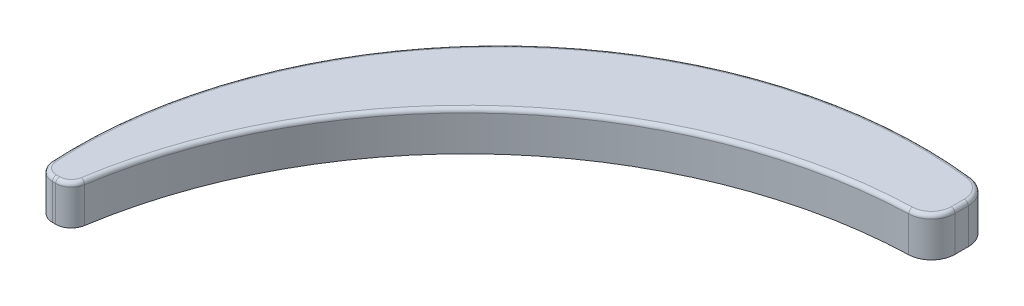
ISO-10303-21;
HEADER;
FILE_DESCRIPTION(('STEP AP214'),'2;1');
FILE_NAME('part.step','',(''),(''),'','','');
FILE_SCHEMA(('AUTOMOTIVE_DESIGN { 1 0 10303 214 1 1 1 1 }'));
ENDSEC;
DATA;
#1=APPLICATION_CONTEXT('core data for automotive mechanical design processes');
#2=APPLICATION_PROTOCOL_DEFINITION('international standard','automotive_design',2000,#1);
#3=PRODUCT_CONTEXT('',#1,'mechanical');
#4=PRODUCT('Part','Part','',(#3));
#5=PRODUCT_RELATED_PRODUCT_CATEGORY('part','',(#4));
#6=PRODUCT_DEFINITION_FORMATION('','',#4);
#7=PRODUCT_DEFINITION_CONTEXT('part definition',#1,'design');
#8=PRODUCT_DEFINITION('design','',#6,#7);
#9=PRODUCT_DEFINITION_SHAPE('','',#8);
#10=(LENGTH_UNIT() NAMED_UNIT(*) SI_UNIT(.MILLI.,.METRE.));
#11=(NAMED_UNIT(*) PLANE_ANGLE_UNIT() SI_UNIT($,.RADIAN.));
#12=(NAMED_UNIT(*) SI_UNIT($,.STERADIAN.) SOLID_ANGLE_UNIT());
#13=UNCERTAINTY_MEASURE_WITH_UNIT(LENGTH_MEASURE(1.E-05),#10,'distance_accuracy_value','');
#14=(GEOMETRIC_REPRESENTATION_CONTEXT(3) GLOBAL_UNCERTAINTY_ASSIGNED_CONTEXT((#13)) GLOBAL_UNIT_ASSIGNED_CONTEXT((#10,
#11,#12)) REPRESENTATION_CONTEXT('',''));
#15=CARTESIAN_POINT('',(0.,0.,0.));
#16=DIRECTION('',(0.,0.,1.));
#17=DIRECTION('',(1.,0.,0.));
#18=AXIS2_PLACEMENT_3D('',#15,#16,#17);
#19=CARTESIAN_POINT('',(32.0869188551007,5.,-59.8439355191756));
#20=DIRECTION('',(0.,-1.,0.));
#21=DIRECTION('',(0.,0.,-1.));
#22=AXIS2_PLACEMENT_3D('',#19,#20,#21);
#23=CYLINDRICAL_SURFACE('',#22,3.);
#24=DIRECTION('',(0.,-1.,0.));
#25=VECTOR('',#24,1.);
#26=CARTESIAN_POINT('',(35.0869188551007,5.,-59.8439355191756));
#27=LINE('',#26,#25);
#28=CARTESIAN_POINT('',(35.0869188551007,4.5,-59.8439355191756));
#29=VERTEX_POINT('',#28);
#30=CARTESIAN_POINT('',(35.0869188551007,0.,-59.8439355191756));
#31=VERTEX_POINT('',#30);
#32=EDGE_CURVE('E123',#29,#31,#27,.T.);
#33=ORIENTED_EDGE('',*,*,#32,.F.);
#34=CARTESIAN_POINT('',(32.0869188551007,4.5,-59.8439355191756));
#35=DIRECTION('',(0.,1.,0.));
#36=DIRECTION('',(0.,0.,1.));
#37=AXIS2_PLACEMENT_3D('',#34,#35,#36);
#38=CIRCLE('',#37,3.);
#39=CARTESIAN_POINT('',(32.1848858792723,4.5,-56.8455355354885));
#40=VERTEX_POINT('',#39);
#41=EDGE_CURVE('E11',#29,#40,#38,.F.);
#42=ORIENTED_EDGE('',*,*,#41,.T.);
#43=DIRECTION('',(0.,-1.,0.));
#44=VECTOR('',#43,1.);
#45=CARTESIAN_POINT('',(32.1848858792723,5.,-56.8455355354885));
#46=LINE('',#45,#44);
#47=CARTESIAN_POINT('',(32.1848858792723,0.,-56.8455355354885));
#48=VERTEX_POINT('',#47);
#49=EDGE_CURVE('E144',#40,#48,#46,.T.);
#50=ORIENTED_EDGE('',*,*,#49,.T.);
#51=CARTESIAN_POINT('',(32.0869188551007,0.,-59.8439355191756));
#52=DIRECTION('',(0.,1.,0.));
#53=DIRECTION('',(0.,0.,1.));
#54=AXIS2_PLACEMENT_3D('',#51,#52,#53);
#55=CIRCLE('',#54,3.);
#56=EDGE_CURVE('E138',#48,#31,#55,.T.);
#57=ORIENTED_EDGE('',*,*,#56,.T.);
#58=EDGE_LOOP('',(#33,#42,#50,#57));
#59=FACE_BOUND('',#58,.T.);
#60=ADVANCED_FACE('F35',(#59),#23,.T.);
#61=CARTESIAN_POINT('',(35.0869188551007,5.,-61.5224925150095));
#62=DIRECTION('',(-1.,0.,0.));
#63=DIRECTION('',(0.,0.,1.));
#64=AXIS2_PLACEMENT_3D('',#61,#62,#63);
#65=PLANE('',#64);
#66=DIRECTION('',(0.,-1.,0.));
#67=VECTOR('',#66,1.);
#68=CARTESIAN_POINT('',(35.0869188551007,5.,-61.5224925150095));
#69=LINE('',#68,#67);
#70=CARTESIAN_POINT('',(35.0869188551007,4.5,-61.5224925150095));
#71=VERTEX_POINT('',#70);
#72=CARTESIAN_POINT('',(35.0869188551007,0.,-61.5224925150095));
#73=VERTEX_POINT('',#72);
#74=EDGE_CURVE('E132',#71,#73,#69,.T.);
#75=ORIENTED_EDGE('',*,*,#74,.F.);
#76=DIRECTION('',(0.,0.,-1.));
#77=VECTOR('',#76,1.);
#78=CARTESIAN_POINT('',(35.0869188551007,4.5,-59.8439355191756));
#79=LINE('',#78,#77);
#80=EDGE_CURVE('E44',#71,#29,#79,.F.);
#81=ORIENTED_EDGE('',*,*,#80,.T.);
#82=ORIENTED_EDGE('',*,*,#32,.T.);
#83=DIRECTION('',(0.,0.,-1.));
#84=VECTOR('',#83,1.);
#85=CARTESIAN_POINT('',(35.0869188551007,0.,-61.5224925150095));
#86=LINE('',#85,#84);
#87=EDGE_CURVE('E126',#31,#73,#86,.T.);
#88=ORIENTED_EDGE('',*,*,#87,.T.);
#89=EDGE_LOOP('',(#75,#81,#82,#88));
#90=FACE_BOUND('',#89,.T.);
#91=ADVANCED_FACE('F125',(#90),#65,.F.);
#92=CARTESIAN_POINT('',(32.0869188551007,5.,-61.5224925150095));
#93=DIRECTION('',(0.,-1.,0.));
#94=DIRECTION('',(0.,0.,-1.));
#95=AXIS2_PLACEMENT_3D('',#92,#93,#94);
#96=CYLINDRICAL_SURFACE('',#95,2.99999999999999);
#97=DIRECTION('',(0.,-1.,0.));
#98=VECTOR('',#97,1.);
#99=CARTESIAN_POINT('',(32.439797129918,5.,-64.5016663808928));
#100=LINE('',#99,#98);
#101=CARTESIAN_POINT('',(32.439797129918,4.5,-64.5016663808928));
#102=VERTEX_POINT('',#101);
#103=CARTESIAN_POINT('',(32.439797129918,0.,-64.5016663808928));
#104=VERTEX_POINT('',#103);
#105=EDGE_CURVE('E174',#102,#104,#100,.T.);
#106=ORIENTED_EDGE('',*,*,#105,.F.);
#107=CARTESIAN_POINT('',(32.0869188551007,4.5,-61.5224925150095));
#108=DIRECTION('',(0.,1.,0.));
#109=DIRECTION('',(0.,0.,1.));
#110=AXIS2_PLACEMENT_3D('',#107,#108,#109);
#111=CIRCLE('',#110,2.99999999999999);
#112=EDGE_CURVE('E59',#102,#71,#111,.F.);
#113=ORIENTED_EDGE('',*,*,#112,.T.);
#114=ORIENTED_EDGE('',*,*,#74,.T.);
#115=CARTESIAN_POINT('',(32.0869188551007,0.,-61.5224925150095));
#116=DIRECTION('',(0.,1.,0.));
#117=DIRECTION('',(0.,0.,1.));
#118=AXIS2_PLACEMENT_3D('',#115,#116,#117);
#119=CIRCLE('',#118,2.99999999999999);
#120=EDGE_CURVE('E141',#73,#104,#119,.T.);
#121=ORIENTED_EDGE('',*,*,#120,.T.);
#122=EDGE_LOOP('',(#106,#113,#114,#121));
#123=FACE_BOUND('',#122,.T.);
#124=ADVANCED_FACE('F277',(#123),#96,.T.);
#125=CARTESIAN_POINT('',(26.0869188551007,5.,-10.8675089954));
#126=DIRECTION('',(0.,-1.,0.));
#127=DIRECTION('',(0.,0.,-1.));
#128=AXIS2_PLACEMENT_3D('',#125,#126,#127);
#129=CYLINDRICAL_SURFACE('',#128,54.0090909090909);
#130=DIRECTION('',(0.,-1.,0.));
#131=VECTOR('',#130,1.);
#132=CARTESIAN_POINT('',(-27.8367871367342,5.,-7.83174995809138));
#133=LINE('',#132,#131);
#134=CARTESIAN_POINT('',(-27.8367871367342,4.5,-7.83174995809138));
#135=VERTEX_POINT('',#134);
#136=CARTESIAN_POINT('',(-27.8367871367342,0.,-7.83174995809138));
#137=VERTEX_POINT('',#136);
#138=EDGE_CURVE('E172',#135,#137,#133,.T.);
#139=ORIENTED_EDGE('',*,*,#138,.F.);
#140=CARTESIAN_POINT('',(26.0869188551007,4.5,-10.8675089954));
#141=DIRECTION('',(0.,1.,0.));
#142=DIRECTION('',(0.,0.,1.));
#143=AXIS2_PLACEMENT_3D('',#140,#141,#142);
#144=CIRCLE('',#143,54.0090909090909);
#145=EDGE_CURVE('E202',#135,#102,#144,.F.);
#146=ORIENTED_EDGE('',*,*,#145,.T.);
#147=ORIENTED_EDGE('',*,*,#105,.T.);
#148=CARTESIAN_POINT('',(26.0869188551007,0.,-10.8675089954));
#149=DIRECTION('',(0.,1.,0.));
#150=DIRECTION('',(0.,0.,1.));
#151=AXIS2_PLACEMENT_3D('',#148,#149,#150);
#152=CIRCLE('',#151,54.0090909090909);
#153=EDGE_CURVE('E151',#104,#137,#152,.T.);
#154=ORIENTED_EDGE('',*,*,#153,.T.);
#155=EDGE_LOOP('',(#139,#146,#147,#154));
#156=FACE_BOUND('',#155,.T.);
#157=ADVANCED_FACE('F275',(#156),#129,.T.);
#158=CARTESIAN_POINT('',(-25.8399490087753,5.,-7.9441665526391));
#159=DIRECTION('',(0.,-1.,0.));
#160=DIRECTION('',(0.,0.,-1.));
#161=AXIS2_PLACEMENT_3D('',#158,#159,#160);
#162=CYLINDRICAL_SURFACE('',#161,2.00000000000001);
#163=DIRECTION('',(0.,-1.,0.));
#164=VECTOR('',#163,1.);
#165=CARTESIAN_POINT('',(-25.8399490087753,5.,-5.9441665526391));
#166=LINE('',#165,#164);
#167=CARTESIAN_POINT('',(-25.8399490087753,4.5,-5.9441665526391));
#168=VERTEX_POINT('',#167);
#169=CARTESIAN_POINT('',(-25.8399490087753,0.,-5.9441665526391));
#170=VERTEX_POINT('',#169);
#171=EDGE_CURVE('E170',#168,#170,#166,.T.);
#172=ORIENTED_EDGE('',*,*,#171,.F.);
#173=CARTESIAN_POINT('',(-25.8399490087753,4.5,-7.9441665526391));
#174=DIRECTION('',(0.,1.,0.));
#175=DIRECTION('',(0.,0.,1.));
#176=AXIS2_PLACEMENT_3D('',#173,#174,#175);
#177=CIRCLE('',#176,2.00000000000001);
#178=EDGE_CURVE('E200',#168,#135,#177,.F.);
#179=ORIENTED_EDGE('',*,*,#178,.T.);
#180=ORIENTED_EDGE('',*,*,#138,.T.);
#181=CARTESIAN_POINT('',(-25.8399490087753,0.,-7.9441665526391));
#182=DIRECTION('',(0.,1.,0.));
#183=DIRECTION('',(0.,0.,1.));
#184=AXIS2_PLACEMENT_3D('',#181,#182,#183);
#185=CIRCLE('',#184,2.00000000000001);
#186=EDGE_CURVE('E154',#137,#170,#185,.T.);
#187=ORIENTED_EDGE('',*,*,#186,.T.);
#188=EDGE_LOOP('',(#172,#179,#180,#187));
#189=FACE_BOUND('',#188,.T.);
#190=ADVANCED_FACE('F273',(#189),#162,.T.);
#191=CARTESIAN_POINT('',(-25.4340531982474,5.,-5.9441665526391));
#192=DIRECTION('',(0.,0.,-1.));
#193=DIRECTION('',(-1.,0.,0.));
#194=AXIS2_PLACEMENT_3D('',#191,#192,#193);
#195=PLANE('',#194);
#196=DIRECTION('',(0.,-1.,0.));
#197=VECTOR('',#196,1.);
#198=CARTESIAN_POINT('',(-25.4340531982474,5.,-5.9441665526391));
#199=LINE('',#198,#197);
#200=CARTESIAN_POINT('',(-25.4340531982474,4.5,-5.9441665526391));
#201=VERTEX_POINT('',#200);
#202=CARTESIAN_POINT('',(-25.4340531982474,0.,-5.9441665526391));
#203=VERTEX_POINT('',#202);
#204=EDGE_CURVE('E168',#201,#203,#199,.T.);
#205=ORIENTED_EDGE('',*,*,#204,.F.);
#206=DIRECTION('',(1.,0.,0.));
#207=VECTOR('',#206,1.);
#208=CARTESIAN_POINT('',(-25.8399490087753,4.5,-5.9441665526391));
#209=LINE('',#208,#207);
#210=EDGE_CURVE('E198',#201,#168,#209,.F.);
#211=ORIENTED_EDGE('',*,*,#210,.T.);
#212=ORIENTED_EDGE('',*,*,#171,.T.);
#213=DIRECTION('',(1.,0.,0.));
#214=VECTOR('',#213,1.);
#215=CARTESIAN_POINT('',(-25.4340531982474,0.,-5.9441665526391));
#216=LINE('',#215,#214);
#217=EDGE_CURVE('E157',#170,#203,#216,.T.);
#218=ORIENTED_EDGE('',*,*,#217,.T.);
#219=EDGE_LOOP('',(#205,#211,#212,#218));
#220=FACE_BOUND('',#219,.T.);
#221=ADVANCED_FACE('F261',(#220),#195,.F.);
#222=CARTESIAN_POINT('',(-25.4340531982474,5.,-7.9441665526391));
#223=DIRECTION('',(0.,-1.,0.));
#224=DIRECTION('',(0.,0.,-1.));
#225=AXIS2_PLACEMENT_3D('',#222,#223,#224);
#226=CYLINDRICAL_SURFACE('',#225,2.);
#227=DIRECTION('',(0.,-1.,0.));
#228=VECTOR('',#227,1.);
#229=CARTESIAN_POINT('',(-23.45809253122,5.,-7.63500730182997));
#230=LINE('',#229,#228);
#231=CARTESIAN_POINT('',(-23.45809253122,4.5,-7.63500730182997));
#232=VERTEX_POINT('',#231);
#233=CARTESIAN_POINT('',(-23.45809253122,0.,-7.63500730182997));
#234=VERTEX_POINT('',#233);
#235=EDGE_CURVE('E166',#232,#234,#230,.T.);
#236=ORIENTED_EDGE('',*,*,#235,.F.);
#237=CARTESIAN_POINT('',(-25.4340531982474,4.5,-7.9441665526391));
#238=DIRECTION('',(0.,1.,0.));
#239=DIRECTION('',(0.,0.,1.));
#240=AXIS2_PLACEMENT_3D('',#237,#238,#239);
#241=CIRCLE('',#240,2.);
#242=EDGE_CURVE('E196',#232,#201,#241,.F.);
#243=ORIENTED_EDGE('',*,*,#242,.T.);
#244=ORIENTED_EDGE('',*,*,#204,.T.);
#245=CARTESIAN_POINT('',(-25.4340531982474,0.,-7.9441665526391));
#246=DIRECTION('',(0.,1.,0.));
#247=DIRECTION('',(0.,0.,1.));
#248=AXIS2_PLACEMENT_3D('',#245,#246,#247);
#249=CIRCLE('',#248,2.);
#250=EDGE_CURVE('E160',#203,#234,#249,.T.);
#251=ORIENTED_EDGE('',*,*,#250,.T.);
#252=EDGE_LOOP('',(#236,#243,#244,#251));
#253=FACE_BOUND('',#252,.T.);
#254=ADVANCED_FACE('F258',(#253),#226,.T.);
#255=CARTESIAN_POINT('',(34.0869188551007,5.,1.3684981347247));
#256=DIRECTION('',(0.,-1.,0.));
#257=DIRECTION('',(0.,0.,-1.));
#258=AXIS2_PLACEMENT_3D('',#255,#256,#257);
#259=CYLINDRICAL_SURFACE('',#258,58.2450980392157);
#260=ORIENTED_EDGE('',*,*,#49,.F.);
#261=CARTESIAN_POINT('',(34.0869188551007,4.5,1.3684981347247));
#262=DIRECTION('',(0.,1.,0.));
#263=DIRECTION('',(0.,0.,1.));
#264=AXIS2_PLACEMENT_3D('',#261,#262,#263);
#265=CIRCLE('',#264,58.2450980392157);
#266=EDGE_CURVE('E193',#40,#232,#265,.T.);
#267=ORIENTED_EDGE('',*,*,#266,.T.);
#268=ORIENTED_EDGE('',*,*,#235,.T.);
#269=CARTESIAN_POINT('',(34.0869188551007,0.,1.3684981347247));
#270=DIRECTION('',(0.,-1.,0.));
#271=DIRECTION('',(0.,0.,1.));
#272=AXIS2_PLACEMENT_3D('',#269,#270,#271);
#273=CIRCLE('',#272,58.2450980392157);
#274=EDGE_CURVE('E163',#234,#48,#273,.T.);
#275=ORIENTED_EDGE('',*,*,#274,.T.);
#276=EDGE_LOOP('',(#260,#267,#268,#275));
#277=FACE_BOUND('',#276,.T.);
#278=ADVANCED_FACE('F245',(#277),#259,.F.);
#279=CARTESIAN_POINT('',(32.0869188551007,5.,-59.8439355191756));
#280=DIRECTION('',(0.,1.,0.));
#281=DIRECTION('',(0.,0.,1.));
#282=AXIS2_PLACEMENT_3D('',#279,#280,#281);
#283=PLANE('',#282);
#284=CARTESIAN_POINT('',(-25.4340531982474,5.,-7.9441665526391));
#285=DIRECTION('',(0.,1.,0.));
#286=DIRECTION('',(0.,0.,1.));
#287=AXIS2_PLACEMENT_3D('',#284,#285,#286);
#288=CIRCLE('',#287,1.5);
#289=CARTESIAN_POINT('',(-25.4340531982474,5.,-6.4441665526391));
#290=VERTEX_POINT('',#289);
#291=CARTESIAN_POINT('',(-23.9520826979768,5.,-7.71229711453226));
#292=VERTEX_POINT('',#291);
#293=EDGE_CURVE('E188',#290,#292,#288,.T.);
#294=ORIENTED_EDGE('',*,*,#293,.T.);
#295=CARTESIAN_POINT('',(34.0869188551007,5.,1.3684981347247));
#296=DIRECTION('',(0.,1.,0.));
#297=DIRECTION('',(0.,0.,1.));
#298=AXIS2_PLACEMENT_3D('',#295,#296,#297);
#299=CIRCLE('',#298,58.7450980392157);
#300=CARTESIAN_POINT('',(32.1685580419104,5.,-57.345268866103));
#301=VERTEX_POINT('',#300);
#302=EDGE_CURVE('E190',#292,#301,#299,.F.);
#303=ORIENTED_EDGE('',*,*,#302,.T.);
#304=CARTESIAN_POINT('',(32.0869188551007,5.,-59.8439355191756));
#305=DIRECTION('',(0.,1.,0.));
#306=DIRECTION('',(0.,0.,1.));
#307=AXIS2_PLACEMENT_3D('',#304,#305,#306);
#308=CIRCLE('',#307,2.5);
#309=CARTESIAN_POINT('',(34.5869188551007,5.,-59.8439355191756));
#310=VERTEX_POINT('',#309);
#311=EDGE_CURVE('E131',#301,#310,#308,.T.);
#312=ORIENTED_EDGE('',*,*,#311,.T.);
#313=DIRECTION('',(0.,0.,-1.));
#314=VECTOR('',#313,1.);
#315=CARTESIAN_POINT('',(34.5869188551007,5.,-61.5224925150095));
#316=LINE('',#315,#314);
#317=CARTESIAN_POINT('',(34.5869188551007,5.,-61.5224925150095));
#318=VERTEX_POINT('',#317);
#319=EDGE_CURVE('E178',#310,#318,#316,.T.);
#320=ORIENTED_EDGE('',*,*,#319,.T.);
#321=CARTESIAN_POINT('',(32.0869188551007,5.,-61.5224925150095));
#322=DIRECTION('',(0.,1.,0.));
#323=DIRECTION('',(0.,0.,1.));
#324=AXIS2_PLACEMENT_3D('',#321,#322,#323);
#325=CIRCLE('',#324,2.49999999999999);
#326=CARTESIAN_POINT('',(32.3809840841151,5.,-64.0051374032456));
#327=VERTEX_POINT('',#326);
#328=EDGE_CURVE('E180',#318,#327,#325,.T.);
#329=ORIENTED_EDGE('',*,*,#328,.T.);
#330=CARTESIAN_POINT('',(26.0869188551007,5.,-10.8675089954));
#331=DIRECTION('',(0.,1.,0.));
#332=DIRECTION('',(0.,0.,1.));
#333=AXIS2_PLACEMENT_3D('',#330,#331,#332);
#334=CIRCLE('',#333,53.5090909090909);
#335=CARTESIAN_POINT('',(-27.3375776047445,5.,-7.85985410672831));
#336=VERTEX_POINT('',#335);
#337=EDGE_CURVE('E182',#327,#336,#334,.T.);
#338=ORIENTED_EDGE('',*,*,#337,.T.);
#339=CARTESIAN_POINT('',(-25.8399490087753,5.,-7.9441665526391));
#340=DIRECTION('',(0.,1.,0.));
#341=DIRECTION('',(0.,0.,1.));
#342=AXIS2_PLACEMENT_3D('',#339,#340,#341);
#343=CIRCLE('',#342,1.50000000000001);
#344=CARTESIAN_POINT('',(-25.8399490087753,5.,-6.4441665526391));
#345=VERTEX_POINT('',#344);
#346=EDGE_CURVE('E184',#336,#345,#343,.T.);
#347=ORIENTED_EDGE('',*,*,#346,.T.);
#348=DIRECTION('',(1.,0.,0.));
#349=VECTOR('',#348,1.);
#350=CARTESIAN_POINT('',(-25.4340531982474,5.,-6.4441665526391));
#351=LINE('',#350,#349);
#352=EDGE_CURVE('E186',#345,#290,#351,.T.);
#353=ORIENTED_EDGE('',*,*,#352,.T.);
#354=EDGE_LOOP('',(#294,#303,#312,#320,#329,#338,#347,#353));
#355=FACE_BOUND('',#354,.T.);
#356=ADVANCED_FACE('F233',(#355),#283,.T.);
#357=CARTESIAN_POINT('',(32.0869188551007,0.,-59.8439355191756));
#358=DIRECTION('',(0.,1.,0.));
#359=DIRECTION('',(0.,0.,1.));
#360=AXIS2_PLACEMENT_3D('',#357,#358,#359);
#361=PLANE('',#360);
#362=ORIENTED_EDGE('',*,*,#56,.F.);
#363=ORIENTED_EDGE('',*,*,#274,.F.);
#364=ORIENTED_EDGE('',*,*,#250,.F.);
#365=ORIENTED_EDGE('',*,*,#217,.F.);
#366=ORIENTED_EDGE('',*,*,#186,.F.);
#367=ORIENTED_EDGE('',*,*,#153,.F.);
#368=ORIENTED_EDGE('',*,*,#120,.F.);
#369=ORIENTED_EDGE('',*,*,#87,.F.);
#370=EDGE_LOOP('',(#362,#363,#364,#365,#366,#367,#368,#369));
#371=FACE_BOUND('',#370,.T.);
#372=ADVANCED_FACE('F136',(#371),#361,.F.);
#373=CARTESIAN_POINT('',(26.0869188551007,4.5,-10.8675089954));
#374=DIRECTION('',(0.,1.,0.));
#375=DIRECTION('',(0.,0.,1.));
#376=AXIS2_PLACEMENT_3D('',#373,#374,#375);
#377=TOROIDAL_SURFACE('',#376,53.5090909090909,0.5);
#378=CARTESIAN_POINT('',(32.3809840841151,4.5,-64.0051374032456));
#379=DIRECTION('',(0.993057955294428,0.,0.117626091605775));
#380=DIRECTION('',(0.117626091605775,0.,-0.993057955294428));
#381=AXIS2_PLACEMENT_3D('',#378,#379,#380);
#382=CIRCLE('',#381,0.5);
#383=EDGE_CURVE('E148',#102,#327,#382,.T.);
#384=ORIENTED_EDGE('',*,*,#383,.F.);
#385=ORIENTED_EDGE('',*,*,#145,.F.);
#386=CARTESIAN_POINT('',(-27.3375776047445,4.5,-7.85985410672831));
#387=DIRECTION('',(0.0562082972738613,0.,0.998419063979436));
#388=DIRECTION('',(0.998419063979436,0.,-0.0562082972738613));
#389=AXIS2_PLACEMENT_3D('',#386,#387,#388);
#390=CIRCLE('',#389,0.5);
#391=EDGE_CURVE('E39',#336,#135,#390,.T.);
#392=ORIENTED_EDGE('',*,*,#391,.F.);
#393=ORIENTED_EDGE('',*,*,#337,.F.);
#394=EDGE_LOOP('',(#384,#385,#392,#393));
#395=FACE_BOUND('',#394,.T.);
#396=ADVANCED_FACE('F37',(#395),#377,.T.);
#397=CARTESIAN_POINT('',(-25.8399490087753,4.5,-7.9441665526391));
#398=DIRECTION('',(0.,1.,0.));
#399=DIRECTION('',(0.,0.,1.));
#400=AXIS2_PLACEMENT_3D('',#397,#398,#399);
#401=TOROIDAL_SURFACE('',#400,1.50000000000001,0.5);
#402=ORIENTED_EDGE('',*,*,#391,.T.);
#403=ORIENTED_EDGE('',*,*,#178,.F.);
#404=CARTESIAN_POINT('',(-25.8399490087753,4.5,-6.4441665526391));
#405=DIRECTION('',(1.,0.,0.));
#406=DIRECTION('',(0.,0.,-1.));
#407=AXIS2_PLACEMENT_3D('',#404,#405,#406);
#408=CIRCLE('',#407,0.5);
#409=EDGE_CURVE('E219',#345,#168,#408,.T.);
#410=ORIENTED_EDGE('',*,*,#409,.F.);
#411=ORIENTED_EDGE('',*,*,#346,.F.);
#412=EDGE_LOOP('',(#402,#403,#410,#411));
#413=FACE_BOUND('',#412,.T.);
#414=ADVANCED_FACE('F270',(#413),#401,.T.);
#415=CARTESIAN_POINT('',(32.0869188551007,4.5,-61.5224925150095));
#416=DIRECTION('',(0.,1.,0.));
#417=DIRECTION('',(0.,0.,1.));
#418=AXIS2_PLACEMENT_3D('',#415,#416,#417);
#419=TOROIDAL_SURFACE('',#418,2.49999999999999,0.5);
#420=ORIENTED_EDGE('',*,*,#383,.T.);
#421=ORIENTED_EDGE('',*,*,#328,.F.);
#422=CARTESIAN_POINT('',(34.5869188551007,4.5,-61.5224925150095));
#423=DIRECTION('',(0.,0.,1.));
#424=DIRECTION('',(1.,0.,0.));
#425=AXIS2_PLACEMENT_3D('',#422,#423,#424);
#426=CIRCLE('',#425,0.5);
#427=EDGE_CURVE('E216',#71,#318,#426,.T.);
#428=ORIENTED_EDGE('',*,*,#427,.F.);
#429=ORIENTED_EDGE('',*,*,#112,.F.);
#430=EDGE_LOOP('',(#420,#421,#428,#429));
#431=FACE_BOUND('',#430,.T.);
#432=ADVANCED_FACE('F225',(#431),#419,.T.);
#433=CARTESIAN_POINT('',(32.0869188551007,4.5,-6.4441665526391));
#434=DIRECTION('',(-1.,0.,0.));
#435=DIRECTION('',(0.,0.,1.));
#436=AXIS2_PLACEMENT_3D('',#433,#434,#435);
#437=CYLINDRICAL_SURFACE('',#436,0.5);
#438=ORIENTED_EDGE('',*,*,#409,.T.);
#439=ORIENTED_EDGE('',*,*,#210,.F.);
#440=CARTESIAN_POINT('',(-25.4340531982474,4.5,-6.4441665526391));
#441=DIRECTION('',(1.,0.,0.));
#442=DIRECTION('',(0.,0.,-1.));
#443=AXIS2_PLACEMENT_3D('',#440,#441,#442);
#444=CIRCLE('',#443,0.5);
#445=EDGE_CURVE('E213',#290,#201,#444,.T.);
#446=ORIENTED_EDGE('',*,*,#445,.F.);
#447=ORIENTED_EDGE('',*,*,#352,.F.);
#448=EDGE_LOOP('',(#438,#439,#446,#447));
#449=FACE_BOUND('',#448,.T.);
#450=ADVANCED_FACE('F266',(#449),#437,.T.);
#451=CARTESIAN_POINT('',(34.5869188551007,4.5,-59.8439355191756));
#452=DIRECTION('',(0.,0.,1.));
#453=DIRECTION('',(1.,0.,0.));
#454=AXIS2_PLACEMENT_3D('',#451,#452,#453);
#455=CYLINDRICAL_SURFACE('',#454,0.5);
#456=ORIENTED_EDGE('',*,*,#427,.T.);
#457=ORIENTED_EDGE('',*,*,#319,.F.);
#458=CARTESIAN_POINT('',(34.5869188551007,4.5,-59.8439355191756));
#459=DIRECTION('',(0.,0.,1.));
#460=DIRECTION('',(1.,0.,0.));
#461=AXIS2_PLACEMENT_3D('',#458,#459,#460);
#462=CIRCLE('',#461,0.5);
#463=EDGE_CURVE('E210',#29,#310,#462,.T.);
#464=ORIENTED_EDGE('',*,*,#463,.F.);
#465=ORIENTED_EDGE('',*,*,#80,.F.);
#466=EDGE_LOOP('',(#456,#457,#464,#465));
#467=FACE_BOUND('',#466,.T.);
#468=ADVANCED_FACE('F238',(#467),#455,.T.);
#469=CARTESIAN_POINT('',(-25.4340531982474,4.5,-7.9441665526391));
#470=DIRECTION('',(0.,1.,0.));
#471=DIRECTION('',(0.,0.,1.));
#472=AXIS2_PLACEMENT_3D('',#469,#470,#471);
#473=TOROIDAL_SURFACE('',#472,1.5,0.5);
#474=ORIENTED_EDGE('',*,*,#445,.T.);
#475=ORIENTED_EDGE('',*,*,#242,.F.);
#476=CARTESIAN_POINT('',(-23.9520826979768,4.5,-7.71229711453226));
#477=DIRECTION('',(0.154579625404575,0.,-0.987980333513669));
#478=DIRECTION('',(-0.987980333513669,0.,-0.154579625404575));
#479=AXIS2_PLACEMENT_3D('',#476,#477,#478);
#480=CIRCLE('',#479,0.5);
#481=EDGE_CURVE('E208',#292,#232,#480,.T.);
#482=ORIENTED_EDGE('',*,*,#481,.F.);
#483=ORIENTED_EDGE('',*,*,#293,.F.);
#484=EDGE_LOOP('',(#474,#475,#482,#483));
#485=FACE_BOUND('',#484,.T.);
#486=ADVANCED_FACE('F254',(#485),#473,.T.);
#487=CARTESIAN_POINT('',(32.0869188551007,4.5,-59.8439355191756));
#488=DIRECTION('',(0.,1.,0.));
#489=DIRECTION('',(0.,0.,1.));
#490=AXIS2_PLACEMENT_3D('',#487,#488,#489);
#491=TOROIDAL_SURFACE('',#490,2.5,0.5);
#492=ORIENTED_EDGE('',*,*,#463,.T.);
#493=ORIENTED_EDGE('',*,*,#311,.F.);
#494=CARTESIAN_POINT('',(32.1685580419104,4.5,-57.345268866103));
#495=DIRECTION('',(-0.999466661229042,0.,0.0326556747238664));
#496=DIRECTION('',(0.0326556747238664,0.,0.999466661229042));
#497=AXIS2_PLACEMENT_3D('',#494,#495,#496);
#498=CIRCLE('',#497,0.5);
#499=EDGE_CURVE('E206',#40,#301,#498,.T.);
#500=ORIENTED_EDGE('',*,*,#499,.F.);
#501=ORIENTED_EDGE('',*,*,#41,.F.);
#502=EDGE_LOOP('',(#492,#493,#500,#501));
#503=FACE_BOUND('',#502,.T.);
#504=ADVANCED_FACE('F241',(#503),#491,.T.);
#505=CARTESIAN_POINT('',(34.0869188551007,4.5,1.3684981347247));
#506=DIRECTION('',(0.,1.,0.));
#507=DIRECTION('',(0.,0.,1.));
#508=AXIS2_PLACEMENT_3D('',#505,#506,#507);
#509=TOROIDAL_SURFACE('',#508,58.7450980392157,0.5);
#510=ORIENTED_EDGE('',*,*,#481,.T.);
#511=ORIENTED_EDGE('',*,*,#266,.F.);
#512=ORIENTED_EDGE('',*,*,#499,.T.);
#513=ORIENTED_EDGE('',*,*,#302,.F.);
#514=EDGE_LOOP('',(#510,#511,#512,#513));
#515=FACE_BOUND('',#514,.T.);
#516=ADVANCED_FACE('F248',(#515),#509,.T.);
#517=CLOSED_SHELL('',(#60,#91,#124,#157,#190,#221,#254,#278,#356,#372,#396,#414,#432,#450,#468,
#486,#504,#516));
#518=MANIFOLD_SOLID_BREP('B2',#517);
#519=ADVANCED_BREP_SHAPE_REPRESENTATION('',(#18,#518),#14);
#520=SHAPE_DEFINITION_REPRESENTATION(#9,#519);
ENDSEC;
END-ISO-10303-21;
